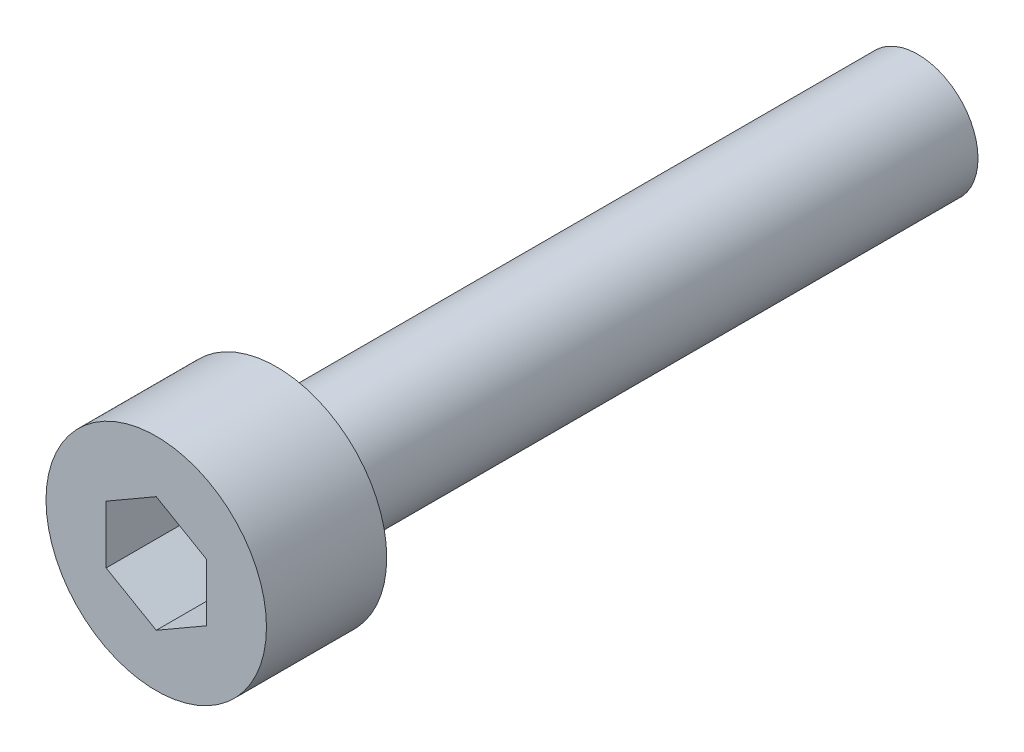
ISO-10303-21;
HEADER;
FILE_DESCRIPTION(('STEP AP214'),'2;1');
FILE_NAME('part.step','',(''),(''),'','','');
FILE_SCHEMA(('AUTOMOTIVE_DESIGN { 1 0 10303 214 1 1 1 1 }'));
ENDSEC;
DATA;
#1=APPLICATION_CONTEXT('core data for automotive mechanical design processes');
#2=APPLICATION_PROTOCOL_DEFINITION('international standard','automotive_design',2000,#1);
#3=PRODUCT_CONTEXT('',#1,'mechanical');
#4=PRODUCT('Part','Part','',(#3));
#5=PRODUCT_RELATED_PRODUCT_CATEGORY('part','',(#4));
#6=PRODUCT_DEFINITION_FORMATION('','',#4);
#7=PRODUCT_DEFINITION_CONTEXT('part definition',#1,'design');
#8=PRODUCT_DEFINITION('design','',#6,#7);
#9=PRODUCT_DEFINITION_SHAPE('','',#8);
#10=(LENGTH_UNIT() NAMED_UNIT(*) SI_UNIT(.MILLI.,.METRE.));
#11=(NAMED_UNIT(*) PLANE_ANGLE_UNIT() SI_UNIT($,.RADIAN.));
#12=(NAMED_UNIT(*) SI_UNIT($,.STERADIAN.) SOLID_ANGLE_UNIT());
#13=UNCERTAINTY_MEASURE_WITH_UNIT(LENGTH_MEASURE(1.E-05),#10,'distance_accuracy_value','');
#14=(GEOMETRIC_REPRESENTATION_CONTEXT(3) GLOBAL_UNCERTAINTY_ASSIGNED_CONTEXT((#13)) GLOBAL_UNIT_ASSIGNED_CONTEXT((#10,
#11,#12)) REPRESENTATION_CONTEXT('',''));
#15=CARTESIAN_POINT('',(0.,0.,0.));
#16=DIRECTION('',(0.,0.,1.));
#17=DIRECTION('',(1.,0.,0.));
#18=AXIS2_PLACEMENT_3D('',#15,#16,#17);
#19=CARTESIAN_POINT('',(0.,0.,0.));
#20=DIRECTION('',(0.,0.,-1.));
#21=DIRECTION('',(-1.,0.,0.));
#22=AXIS2_PLACEMENT_3D('',#19,#20,#21);
#23=CYLINDRICAL_SURFACE('',#22,1.5);
#24=CARTESIAN_POINT('',(0.,0.,0.));
#25=DIRECTION('',(0.,0.,1.));
#26=DIRECTION('',(1.,0.,0.));
#27=AXIS2_PLACEMENT_3D('',#24,#25,#26);
#28=CIRCLE('',#27,1.5);
#29=CARTESIAN_POINT('',(1.5,0.,0.));
#30=VERTEX_POINT('',#29);
#31=EDGE_CURVE('E11',#30,#30,#28,.T.);
#32=ORIENTED_EDGE('',*,*,#31,.F.);
#33=EDGE_LOOP('',(#32));
#34=FACE_BOUND('',#33,.T.);
#35=CARTESIAN_POINT('',(0.,0.,-16.));
#36=DIRECTION('',(0.,0.,1.));
#37=DIRECTION('',(1.,0.,0.));
#38=AXIS2_PLACEMENT_3D('',#35,#36,#37);
#39=CIRCLE('',#38,1.5);
#40=CARTESIAN_POINT('',(1.5,0.,-16.));
#41=VERTEX_POINT('',#40);
#42=EDGE_CURVE('E46',#41,#41,#39,.T.);
#43=ORIENTED_EDGE('',*,*,#42,.T.);
#44=EDGE_LOOP('',(#43));
#45=FACE_BOUND('',#44,.T.);
#46=ADVANCED_FACE('F43',(#34,#45),#23,.T.);
#47=CARTESIAN_POINT('',(0.,0.,-16.));
#48=DIRECTION('',(0.,0.,1.));
#49=DIRECTION('',(1.,0.,0.));
#50=AXIS2_PLACEMENT_3D('',#47,#48,#49);
#51=PLANE('',#50);
#52=ORIENTED_EDGE('',*,*,#42,.F.);
#53=EDGE_LOOP('',(#52));
#54=FACE_BOUND('',#53,.T.);
#55=ADVANCED_FACE('F164',(#54),#51,.F.);
#56=CARTESIAN_POINT('',(0.,0.,3.));
#57=DIRECTION('',(0.,0.,1.));
#58=DIRECTION('',(1.,0.,0.));
#59=AXIS2_PLACEMENT_3D('',#56,#57,#58);
#60=PLANE('',#59);
#61=CARTESIAN_POINT('',(0.,0.,3.));
#62=DIRECTION('',(0.,0.,1.));
#63=DIRECTION('',(1.,0.,0.));
#64=AXIS2_PLACEMENT_3D('',#61,#62,#63);
#65=CIRCLE('',#64,2.75);
#66=CARTESIAN_POINT('',(2.75,0.,3.));
#67=VERTEX_POINT('',#66);
#68=EDGE_CURVE('E146',#67,#67,#65,.T.);
#69=ORIENTED_EDGE('',*,*,#68,.T.);
#70=EDGE_LOOP('',(#69));
#71=FACE_BOUND('',#70,.T.);
#72=DIRECTION('',(-0.866025403784439,0.5,0.));
#73=VECTOR('',#72,1.);
#74=CARTESIAN_POINT('',(1.25,0.721687836487032,3.));
#75=LINE('',#74,#73);
#76=CARTESIAN_POINT('',(1.25,0.721687836487032,3.));
#77=VERTEX_POINT('',#76);
#78=CARTESIAN_POINT('',(0.,1.44337567297406,3.));
#79=VERTEX_POINT('',#78);
#80=EDGE_CURVE('E103',#77,#79,#75,.T.);
#81=ORIENTED_EDGE('',*,*,#80,.F.);
#82=DIRECTION('',(0.,1.,0.));
#83=VECTOR('',#82,1.);
#84=CARTESIAN_POINT('',(1.25,-0.721687836487033,3.));
#85=LINE('',#84,#83);
#86=CARTESIAN_POINT('',(1.25,-0.721687836487033,3.));
#87=VERTEX_POINT('',#86);
#88=EDGE_CURVE('E94',#87,#77,#85,.T.);
#89=ORIENTED_EDGE('',*,*,#88,.F.);
#90=DIRECTION('',(0.866025403784439,0.5,0.));
#91=VECTOR('',#90,1.);
#92=CARTESIAN_POINT('',(0.,-1.44337567297406,3.));
#93=LINE('',#92,#91);
#94=CARTESIAN_POINT('',(0.,-1.44337567297406,3.));
#95=VERTEX_POINT('',#94);
#96=EDGE_CURVE('E124',#95,#87,#93,.T.);
#97=ORIENTED_EDGE('',*,*,#96,.F.);
#98=DIRECTION('',(0.866025403784439,-0.5,0.));
#99=VECTOR('',#98,1.);
#100=CARTESIAN_POINT('',(-1.25,-0.721687836487032,3.));
#101=LINE('',#100,#99);
#102=CARTESIAN_POINT('',(-1.25,-0.721687836487032,3.));
#103=VERTEX_POINT('',#102);
#104=EDGE_CURVE('E121',#103,#95,#101,.T.);
#105=ORIENTED_EDGE('',*,*,#104,.F.);
#106=DIRECTION('',(0.,-1.,0.));
#107=VECTOR('',#106,1.);
#108=CARTESIAN_POINT('',(-1.25,0.721687836487032,3.));
#109=LINE('',#108,#107);
#110=CARTESIAN_POINT('',(-1.25,0.721687836487032,3.));
#111=VERTEX_POINT('',#110);
#112=EDGE_CURVE('E117',#111,#103,#109,.T.);
#113=ORIENTED_EDGE('',*,*,#112,.F.);
#114=DIRECTION('',(-0.866025403784439,-0.5,0.));
#115=VECTOR('',#114,1.);
#116=CARTESIAN_POINT('',(0.,1.44337567297406,3.));
#117=LINE('',#116,#115);
#118=EDGE_CURVE('E115',#79,#111,#117,.T.);
#119=ORIENTED_EDGE('',*,*,#118,.F.);
#120=EDGE_LOOP('',(#81,#89,#97,#105,#113,#119));
#121=FACE_BOUND('',#120,.T.);
#122=ADVANCED_FACE('F113',(#71,#121),#60,.T.);
#123=CARTESIAN_POINT('',(0.,0.,0.));
#124=DIRECTION('',(0.,0.,1.));
#125=DIRECTION('',(1.,0.,0.));
#126=AXIS2_PLACEMENT_3D('',#123,#124,#125);
#127=PLANE('',#126);
#128=ORIENTED_EDGE('',*,*,#31,.T.);
#129=EDGE_LOOP('',(#128));
#130=FACE_BOUND('',#129,.T.);
#131=CARTESIAN_POINT('',(0.,0.,0.));
#132=DIRECTION('',(0.,0.,1.));
#133=DIRECTION('',(1.,0.,0.));
#134=AXIS2_PLACEMENT_3D('',#131,#132,#133);
#135=CIRCLE('',#134,2.75);
#136=CARTESIAN_POINT('',(2.75,0.,0.));
#137=VERTEX_POINT('',#136);
#138=EDGE_CURVE('E109',#137,#137,#135,.T.);
#139=ORIENTED_EDGE('',*,*,#138,.F.);
#140=EDGE_LOOP('',(#139));
#141=FACE_BOUND('',#140,.T.);
#142=ADVANCED_FACE('F154',(#130,#141),#127,.F.);
#143=CARTESIAN_POINT('',(0.,0.,3.));
#144=DIRECTION('',(0.,0.,-1.));
#145=DIRECTION('',(-1.,0.,0.));
#146=AXIS2_PLACEMENT_3D('',#143,#144,#145);
#147=CYLINDRICAL_SURFACE('',#146,2.75);
#148=ORIENTED_EDGE('',*,*,#68,.F.);
#149=EDGE_LOOP('',(#148));
#150=FACE_BOUND('',#149,.T.);
#151=ORIENTED_EDGE('',*,*,#138,.T.);
#152=EDGE_LOOP('',(#151));
#153=FACE_BOUND('',#152,.T.);
#154=ADVANCED_FACE('F152',(#150,#153),#147,.T.);
#155=CARTESIAN_POINT('',(1.25,-0.721687836487033,3.));
#156=DIRECTION('',(-1.,0.,0.));
#157=DIRECTION('',(0.,-1.,0.));
#158=AXIS2_PLACEMENT_3D('',#155,#156,#157);
#159=PLANE('',#158);
#160=DIRECTION('',(0.,1.,0.));
#161=VECTOR('',#160,1.);
#162=CARTESIAN_POINT('',(1.25,-0.721687836487033,0.));
#163=LINE('',#162,#161);
#164=CARTESIAN_POINT('',(1.25,-0.721687836487033,0.));
#165=VERTEX_POINT('',#164);
#166=CARTESIAN_POINT('',(1.25,0.721687836487032,0.));
#167=VERTEX_POINT('',#166);
#168=EDGE_CURVE('E57',#165,#167,#163,.T.);
#169=ORIENTED_EDGE('',*,*,#168,.F.);
#170=DIRECTION('',(0.,0.,-1.));
#171=VECTOR('',#170,1.);
#172=CARTESIAN_POINT('',(1.25,-0.721687836487033,3.));
#173=LINE('',#172,#171);
#174=EDGE_CURVE('E99',#87,#165,#173,.T.);
#175=ORIENTED_EDGE('',*,*,#174,.F.);
#176=ORIENTED_EDGE('',*,*,#88,.T.);
#177=DIRECTION('',(0.,0.,-1.));
#178=VECTOR('',#177,1.);
#179=CARTESIAN_POINT('',(1.25,0.721687836487032,3.));
#180=LINE('',#179,#178);
#181=EDGE_CURVE('E97',#77,#167,#180,.T.);
#182=ORIENTED_EDGE('',*,*,#181,.T.);
#183=EDGE_LOOP('',(#169,#175,#176,#182));
#184=FACE_BOUND('',#183,.T.);
#185=ADVANCED_FACE('F96',(#184),#159,.T.);
#186=CARTESIAN_POINT('',(1.25,0.721687836487032,3.));
#187=DIRECTION('',(-0.5,-0.866025403784439,0.));
#188=DIRECTION('',(0.866025403784439,-0.5,0.));
#189=AXIS2_PLACEMENT_3D('',#186,#187,#188);
#190=PLANE('',#189);
#191=DIRECTION('',(-0.866025403784439,0.5,0.));
#192=VECTOR('',#191,1.);
#193=CARTESIAN_POINT('',(1.25,0.721687836487032,0.));
#194=LINE('',#193,#192);
#195=CARTESIAN_POINT('',(0.,1.44337567297406,0.));
#196=VERTEX_POINT('',#195);
#197=EDGE_CURVE('E61',#167,#196,#194,.T.);
#198=ORIENTED_EDGE('',*,*,#197,.F.);
#199=ORIENTED_EDGE('',*,*,#181,.F.);
#200=ORIENTED_EDGE('',*,*,#80,.T.);
#201=DIRECTION('',(0.,0.,-1.));
#202=VECTOR('',#201,1.);
#203=CARTESIAN_POINT('',(0.,1.44337567297406,3.));
#204=LINE('',#203,#202);
#205=EDGE_CURVE('E110',#79,#196,#204,.T.);
#206=ORIENTED_EDGE('',*,*,#205,.T.);
#207=EDGE_LOOP('',(#198,#199,#200,#206));
#208=FACE_BOUND('',#207,.T.);
#209=ADVANCED_FACE('F107',(#208),#190,.T.);
#210=CARTESIAN_POINT('',(0.,1.44337567297406,3.));
#211=DIRECTION('',(0.5,-0.866025403784439,0.));
#212=DIRECTION('',(0.866025403784439,0.5,0.));
#213=AXIS2_PLACEMENT_3D('',#210,#211,#212);
#214=PLANE('',#213);
#215=DIRECTION('',(-0.866025403784439,-0.5,0.));
#216=VECTOR('',#215,1.);
#217=CARTESIAN_POINT('',(0.,1.44337567297406,0.));
#218=LINE('',#217,#216);
#219=CARTESIAN_POINT('',(-1.25,0.721687836487032,0.));
#220=VERTEX_POINT('',#219);
#221=EDGE_CURVE('E128',#196,#220,#218,.T.);
#222=ORIENTED_EDGE('',*,*,#221,.F.);
#223=ORIENTED_EDGE('',*,*,#205,.F.);
#224=ORIENTED_EDGE('',*,*,#118,.T.);
#225=DIRECTION('',(0.,0.,-1.));
#226=VECTOR('',#225,1.);
#227=CARTESIAN_POINT('',(-1.25,0.721687836487032,3.));
#228=LINE('',#227,#226);
#229=EDGE_CURVE('E142',#111,#220,#228,.T.);
#230=ORIENTED_EDGE('',*,*,#229,.T.);
#231=EDGE_LOOP('',(#222,#223,#224,#230));
#232=FACE_BOUND('',#231,.T.);
#233=ADVANCED_FACE('F199',(#232),#214,.T.);
#234=CARTESIAN_POINT('',(-1.25,0.721687836487032,3.));
#235=DIRECTION('',(1.,0.,0.));
#236=DIRECTION('',(0.,1.,0.));
#237=AXIS2_PLACEMENT_3D('',#234,#235,#236);
#238=PLANE('',#237);
#239=DIRECTION('',(0.,-1.,0.));
#240=VECTOR('',#239,1.);
#241=CARTESIAN_POINT('',(-1.25,0.721687836487032,0.));
#242=LINE('',#241,#240);
#243=CARTESIAN_POINT('',(-1.25,-0.721687836487033,0.));
#244=VERTEX_POINT('',#243);
#245=EDGE_CURVE('E130',#220,#244,#242,.T.);
#246=ORIENTED_EDGE('',*,*,#245,.F.);
#247=ORIENTED_EDGE('',*,*,#229,.F.);
#248=ORIENTED_EDGE('',*,*,#112,.T.);
#249=DIRECTION('',(0.,0.,-1.));
#250=VECTOR('',#249,1.);
#251=CARTESIAN_POINT('',(-1.25,-0.721687836487032,3.));
#252=LINE('',#251,#250);
#253=EDGE_CURVE('E139',#103,#244,#252,.T.);
#254=ORIENTED_EDGE('',*,*,#253,.T.);
#255=EDGE_LOOP('',(#246,#247,#248,#254));
#256=FACE_BOUND('',#255,.T.);
#257=ADVANCED_FACE('F192',(#256),#238,.T.);
#258=CARTESIAN_POINT('',(-1.25,-0.721687836487032,3.));
#259=DIRECTION('',(0.5,0.866025403784439,0.));
#260=DIRECTION('',(-0.866025403784439,0.5,0.));
#261=AXIS2_PLACEMENT_3D('',#258,#259,#260);
#262=PLANE('',#261);
#263=DIRECTION('',(0.866025403784439,-0.5,0.));
#264=VECTOR('',#263,1.);
#265=CARTESIAN_POINT('',(-1.25,-0.721687836487032,0.));
#266=LINE('',#265,#264);
#267=CARTESIAN_POINT('',(0.,-1.44337567297406,0.));
#268=VERTEX_POINT('',#267);
#269=EDGE_CURVE('E132',#244,#268,#266,.T.);
#270=ORIENTED_EDGE('',*,*,#269,.F.);
#271=ORIENTED_EDGE('',*,*,#253,.F.);
#272=ORIENTED_EDGE('',*,*,#104,.T.);
#273=DIRECTION('',(0.,0.,-1.));
#274=VECTOR('',#273,1.);
#275=CARTESIAN_POINT('',(0.,-1.44337567297406,3.));
#276=LINE('',#275,#274);
#277=EDGE_CURVE('E136',#95,#268,#276,.T.);
#278=ORIENTED_EDGE('',*,*,#277,.T.);
#279=EDGE_LOOP('',(#270,#271,#272,#278));
#280=FACE_BOUND('',#279,.T.);
#281=ADVANCED_FACE('F186',(#280),#262,.T.);
#282=CARTESIAN_POINT('',(0.,-1.44337567297406,3.));
#283=DIRECTION('',(-0.5,0.866025403784439,0.));
#284=DIRECTION('',(-0.866025403784439,-0.5,0.));
#285=AXIS2_PLACEMENT_3D('',#282,#283,#284);
#286=PLANE('',#285);
#287=DIRECTION('',(0.866025403784439,0.5,0.));
#288=VECTOR('',#287,1.);
#289=CARTESIAN_POINT('',(0.,-1.44337567297406,0.));
#290=LINE('',#289,#288);
#291=EDGE_CURVE('E104',#268,#165,#290,.T.);
#292=ORIENTED_EDGE('',*,*,#291,.F.);
#293=ORIENTED_EDGE('',*,*,#277,.F.);
#294=ORIENTED_EDGE('',*,*,#96,.T.);
#295=ORIENTED_EDGE('',*,*,#174,.T.);
#296=EDGE_LOOP('',(#292,#293,#294,#295));
#297=FACE_BOUND('',#296,.T.);
#298=ADVANCED_FACE('F182',(#297),#286,.T.);
#299=CARTESIAN_POINT('',(0.,0.,0.));
#300=DIRECTION('',(0.,0.,1.));
#301=DIRECTION('',(1.,0.,0.));
#302=AXIS2_PLACEMENT_3D('',#299,#300,#301);
#303=PLANE('',#302);
#304=ORIENTED_EDGE('',*,*,#168,.T.);
#305=ORIENTED_EDGE('',*,*,#197,.T.);
#306=ORIENTED_EDGE('',*,*,#221,.T.);
#307=ORIENTED_EDGE('',*,*,#245,.T.);
#308=ORIENTED_EDGE('',*,*,#269,.T.);
#309=ORIENTED_EDGE('',*,*,#291,.T.);
#310=EDGE_LOOP('',(#304,#305,#306,#307,#308,#309));
#311=FACE_BOUND('',#310,.T.);
#312=ADVANCED_FACE('F180',(#311),#303,.T.);
#313=CLOSED_SHELL('',(#46,#55,#122,#142,#154,#185,#209,#233,#257,#281,#298,#312));
#314=MANIFOLD_SOLID_BREP('B2',#313);
#315=ADVANCED_BREP_SHAPE_REPRESENTATION('',(#18,#314),#14);
#316=SHAPE_DEFINITION_REPRESENTATION(#9,#315);
ENDSEC;
END-ISO-10303-21;
